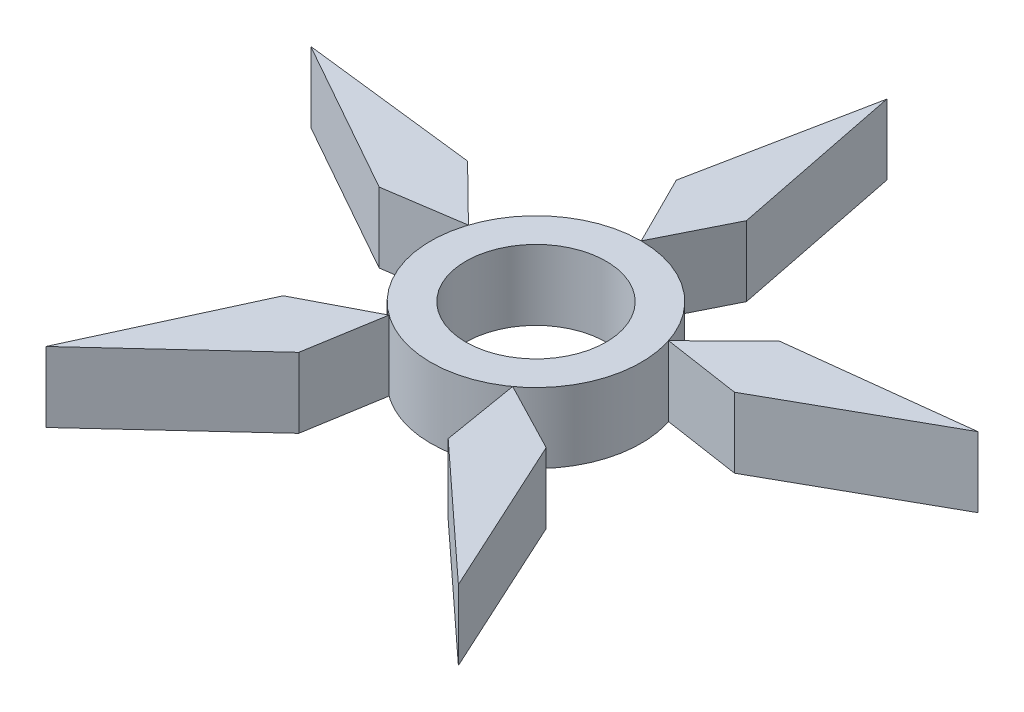
ISO-10303-21;
HEADER;
FILE_DESCRIPTION(('STEP AP214'),'2;1');
FILE_NAME('part.step','',(''),(''),'','','');
FILE_SCHEMA(('AUTOMOTIVE_DESIGN { 1 0 10303 214 1 1 1 1 }'));
ENDSEC;
DATA;
#1=APPLICATION_CONTEXT('core data for automotive mechanical design processes');
#2=APPLICATION_PROTOCOL_DEFINITION('international standard','automotive_design',2000,#1);
#3=PRODUCT_CONTEXT('',#1,'mechanical');
#4=PRODUCT('Part','Part','',(#3));
#5=PRODUCT_RELATED_PRODUCT_CATEGORY('part','',(#4));
#6=PRODUCT_DEFINITION_FORMATION('','',#4);
#7=PRODUCT_DEFINITION_CONTEXT('part definition',#1,'design');
#8=PRODUCT_DEFINITION('design','',#6,#7);
#9=PRODUCT_DEFINITION_SHAPE('','',#8);
#10=(LENGTH_UNIT() NAMED_UNIT(*) SI_UNIT(.MILLI.,.METRE.));
#11=(NAMED_UNIT(*) PLANE_ANGLE_UNIT() SI_UNIT($,.RADIAN.));
#12=(NAMED_UNIT(*) SI_UNIT($,.STERADIAN.) SOLID_ANGLE_UNIT());
#13=UNCERTAINTY_MEASURE_WITH_UNIT(LENGTH_MEASURE(1.E-05),#10,'distance_accuracy_value','');
#14=(GEOMETRIC_REPRESENTATION_CONTEXT(3) GLOBAL_UNCERTAINTY_ASSIGNED_CONTEXT((#13)) GLOBAL_UNIT_ASSIGNED_CONTEXT((#10,
#11,#12)) REPRESENTATION_CONTEXT('',''));
#15=CARTESIAN_POINT('',(0.,0.,0.));
#16=DIRECTION('',(0.,0.,1.));
#17=DIRECTION('',(1.,0.,0.));
#18=AXIS2_PLACEMENT_3D('',#15,#16,#17);
#19=CARTESIAN_POINT('',(-2.2231327935504,1.,-1.24807074408497));
#20=DIRECTION('',(-0.701718606426049,0.,0.712454207227022));
#21=DIRECTION('',(0.712454207227022,0.,0.701718606426049));
#22=AXIS2_PLACEMENT_3D('',#19,#20,#21);
#23=PLANE('',#22);
#24=DIRECTION('',(-0.712454207227022,0.,-0.701718606426049));
#25=VECTOR('',#24,1.);
#26=CARTESIAN_POINT('',(-2.2231327935504,0.,-1.24807074408497));
#27=LINE('',#26,#25);
#28=CARTESIAN_POINT('',(-1.42658477444273,0.,-0.463525491562437));
#29=VERTEX_POINT('',#28);
#30=CARTESIAN_POINT('',(-2.2231327935504,0.,-1.24807074408497));
#31=VERTEX_POINT('',#30);
#32=EDGE_CURVE('E107',#29,#31,#27,.T.);
#33=ORIENTED_EDGE('',*,*,#32,.T.);
#34=DIRECTION('',(0.,-1.,0.));
#35=VECTOR('',#34,1.);
#36=CARTESIAN_POINT('',(-2.2231327935504,1.,-1.24807074408497));
#37=LINE('',#36,#35);
#38=CARTESIAN_POINT('',(-2.2231327935504,1.,-1.24807074408497));
#39=VERTEX_POINT('',#38);
#40=EDGE_CURVE('E12',#39,#31,#37,.T.);
#41=ORIENTED_EDGE('',*,*,#40,.F.);
#42=DIRECTION('',(-0.712454207227022,0.,-0.701718606426049));
#43=VECTOR('',#42,1.);
#44=CARTESIAN_POINT('',(-2.2231327935504,1.,-1.24807074408497));
#45=LINE('',#44,#43);
#46=CARTESIAN_POINT('',(-1.42658477444273,1.,-0.463525491562437));
#47=VERTEX_POINT('',#46);
#48=EDGE_CURVE('E95',#47,#39,#45,.T.);
#49=ORIENTED_EDGE('',*,*,#48,.F.);
#50=DIRECTION('',(0.,-1.,0.));
#51=VECTOR('',#50,1.);
#52=CARTESIAN_POINT('',(-1.42658477444273,1.,-0.463525491562437));
#53=LINE('',#52,#51);
#54=EDGE_CURVE('E103',#47,#29,#53,.T.);
#55=ORIENTED_EDGE('',*,*,#54,.T.);
#56=EDGE_LOOP('',(#33,#41,#49,#55));
#57=FACE_BOUND('',#56,.T.);
#58=ADVANCED_FACE('F44',(#57),#23,.F.);
#59=CARTESIAN_POINT('',(-4.75528258147575,1.,-1.54508497187479));
#60=DIRECTION('',(-0.116498564870384,0.,0.993190859997786));
#61=DIRECTION('',(0.993190859997786,0.,0.116498564870384));
#62=AXIS2_PLACEMENT_3D('',#59,#60,#61);
#63=PLANE('',#62);
#64=DIRECTION('',(-0.993190859997786,0.,-0.116498564870384));
#65=VECTOR('',#64,1.);
#66=CARTESIAN_POINT('',(-4.75528258147575,0.,-1.54508497187479));
#67=LINE('',#66,#65);
#68=CARTESIAN_POINT('',(-4.75528258147575,0.,-1.54508497187479));
#69=VERTEX_POINT('',#68);
#70=EDGE_CURVE('E99',#31,#69,#67,.T.);
#71=ORIENTED_EDGE('',*,*,#70,.T.);
#72=DIRECTION('',(0.,-1.,0.));
#73=VECTOR('',#72,1.);
#74=CARTESIAN_POINT('',(-4.75528258147575,1.,-1.54508497187479));
#75=LINE('',#74,#73);
#76=CARTESIAN_POINT('',(-4.75528258147575,1.,-1.54508497187479));
#77=VERTEX_POINT('',#76);
#78=EDGE_CURVE('E52',#77,#69,#75,.T.);
#79=ORIENTED_EDGE('',*,*,#78,.F.);
#80=DIRECTION('',(-0.993190859997786,0.,-0.116498564870384));
#81=VECTOR('',#80,1.);
#82=CARTESIAN_POINT('',(-4.75528258147575,1.,-1.54508497187479));
#83=LINE('',#82,#81);
#84=EDGE_CURVE('E90',#39,#77,#83,.T.);
#85=ORIENTED_EDGE('',*,*,#84,.F.);
#86=ORIENTED_EDGE('',*,*,#40,.T.);
#87=EDGE_LOOP('',(#71,#79,#85,#86));
#88=FACE_BOUND('',#87,.T.);
#89=ADVANCED_FACE('F98',(#88),#63,.F.);
#90=CARTESIAN_POINT('',(-2.53214978792536,1.,-0.297014227789821));
#91=DIRECTION('',(0.489533621417964,0.,-0.871984422740116));
#92=DIRECTION('',(-0.871984422740116,0.,-0.489533621417964));
#93=AXIS2_PLACEMENT_3D('',#90,#91,#92);
#94=PLANE('',#93);
#95=DIRECTION('',(0.871984422740116,0.,0.489533621417964));
#96=VECTOR('',#95,1.);
#97=CARTESIAN_POINT('',(-2.53214978792536,0.,-0.297014227789821));
#98=LINE('',#97,#96);
#99=CARTESIAN_POINT('',(-2.53214978792536,0.,-0.297014227789821));
#100=VERTEX_POINT('',#99);
#101=EDGE_CURVE('E77',#69,#100,#98,.T.);
#102=ORIENTED_EDGE('',*,*,#101,.T.);
#103=DIRECTION('',(0.,-1.,0.));
#104=VECTOR('',#103,1.);
#105=CARTESIAN_POINT('',(-2.53214978792536,1.,-0.297014227789821));
#106=LINE('',#105,#104);
#107=CARTESIAN_POINT('',(-2.53214978792536,1.,-0.297014227789821));
#108=VERTEX_POINT('',#107);
#109=EDGE_CURVE('E100',#108,#100,#106,.T.);
#110=ORIENTED_EDGE('',*,*,#109,.F.);
#111=DIRECTION('',(0.871984422740116,0.,0.489533621417964));
#112=VECTOR('',#111,1.);
#113=CARTESIAN_POINT('',(-2.53214978792536,1.,-0.297014227789821));
#114=LINE('',#113,#112);
#115=EDGE_CURVE('E93',#77,#108,#114,.T.);
#116=ORIENTED_EDGE('',*,*,#115,.F.);
#117=ORIENTED_EDGE('',*,*,#78,.T.);
#118=EDGE_LOOP('',(#102,#110,#116,#117));
#119=FACE_BOUND('',#118,.T.);
#120=ADVANCED_FACE('F101',(#119),#94,.F.);
#121=CARTESIAN_POINT('',(-1.42658477444273,1.,-0.463525491562437));
#122=DIRECTION('',(-0.148932201925988,0.,-0.988847409477052));
#123=DIRECTION('',(-0.988847409477052,0.,0.148932201925988));
#124=AXIS2_PLACEMENT_3D('',#121,#122,#123);
#125=PLANE('',#124);
#126=DIRECTION('',(0.988847409477052,0.,-0.148932201925988));
#127=VECTOR('',#126,1.);
#128=CARTESIAN_POINT('',(-1.42658477444273,0.,-0.463525491562437));
#129=LINE('',#128,#127);
#130=EDGE_CURVE('E83',#100,#29,#129,.T.);
#131=ORIENTED_EDGE('',*,*,#130,.T.);
#132=ORIENTED_EDGE('',*,*,#54,.F.);
#133=DIRECTION('',(0.988847409477052,0.,-0.148932201925988));
#134=VECTOR('',#133,1.);
#135=CARTESIAN_POINT('',(-1.42658477444273,1.,-0.463525491562437));
#136=LINE('',#135,#134);
#137=EDGE_CURVE('E60',#108,#47,#136,.T.);
#138=ORIENTED_EDGE('',*,*,#137,.F.);
#139=ORIENTED_EDGE('',*,*,#109,.T.);
#140=EDGE_LOOP('',(#131,#132,#138,#139));
#141=FACE_BOUND('',#140,.T.);
#142=ADVANCED_FACE('F114',(#141),#125,.F.);
#143=CARTESIAN_POINT('',(0.,1.,0.));
#144=DIRECTION('',(0.,-1.,0.));
#145=DIRECTION('',(-0.95105651629515,0.,-0.309016994374958));
#146=AXIS2_PLACEMENT_3D('',#143,#144,#145);
#147=PLANE('',#146);
#148=ORIENTED_EDGE('',*,*,#48,.T.);
#149=ORIENTED_EDGE('',*,*,#84,.T.);
#150=ORIENTED_EDGE('',*,*,#115,.T.);
#151=ORIENTED_EDGE('',*,*,#137,.T.);
#152=EDGE_LOOP('',(#148,#149,#150,#151));
#153=FACE_BOUND('',#152,.T.);
#154=ADVANCED_FACE('F91',(#153),#147,.F.);
#155=CARTESIAN_POINT('',(0.,0.,0.));
#156=DIRECTION('',(0.,-1.,0.));
#157=DIRECTION('',(-0.95105651629515,0.,-0.309016994374958));
#158=AXIS2_PLACEMENT_3D('',#155,#156,#157);
#159=PLANE('',#158);
#160=ORIENTED_EDGE('',*,*,#32,.F.);
#161=ORIENTED_EDGE('',*,*,#130,.F.);
#162=ORIENTED_EDGE('',*,*,#101,.F.);
#163=ORIENTED_EDGE('',*,*,#70,.F.);
#164=EDGE_LOOP('',(#160,#161,#162,#163));
#165=FACE_BOUND('',#164,.T.);
#166=ADVANCED_FACE('F117',(#165),#159,.T.);
#167=CLOSED_SHELL('',(#58,#89,#120,#142,#154,#166));
#168=MANIFOLD_SOLID_BREP('B2',#167);
#169=CARTESIAN_POINT('',(-1.87397162791867,1.,1.72864985979112));
#170=DIRECTION('',(0.460741241690404,0.,0.887534510994127));
#171=DIRECTION('',(0.887534510994127,0.,-0.460741241690404));
#172=AXIS2_PLACEMENT_3D('',#169,#170,#171);
#173=PLANE('',#172);
#174=DIRECTION('',(-0.887534510994127,0.,0.460741241690404));
#175=VECTOR('',#174,1.);
#176=CARTESIAN_POINT('',(-1.87397162791867,0.,1.72864985979112));
#177=LINE('',#176,#175);
#178=CARTESIAN_POINT('',(-0.88167787843872,0.,1.21352549156241));
#179=VERTEX_POINT('',#178);
#180=CARTESIAN_POINT('',(-1.87397162791867,0.,1.72864985979112));
#181=VERTEX_POINT('',#180);
#182=EDGE_CURVE('E241',#179,#181,#177,.T.);
#183=ORIENTED_EDGE('',*,*,#182,.T.);
#184=DIRECTION('',(0.,-1.,0.));
#185=VECTOR('',#184,1.);
#186=CARTESIAN_POINT('',(-1.87397162791867,1.,1.72864985979112));
#187=LINE('',#186,#185);
#188=CARTESIAN_POINT('',(-1.87397162791867,1.,1.72864985979112));
#189=VERTEX_POINT('',#188);
#190=EDGE_CURVE('E42',#189,#181,#187,.T.);
#191=ORIENTED_EDGE('',*,*,#190,.F.);
#192=DIRECTION('',(-0.887534510994127,0.,0.460741241690404));
#193=VECTOR('',#192,1.);
#194=CARTESIAN_POINT('',(-1.87397162791867,1.,1.72864985979112));
#195=LINE('',#194,#193);
#196=CARTESIAN_POINT('',(-0.88167787843872,1.,1.21352549156241));
#197=VERTEX_POINT('',#196);
#198=EDGE_CURVE('E229',#197,#189,#195,.T.);
#199=ORIENTED_EDGE('',*,*,#198,.F.);
#200=DIRECTION('',(0.,-1.,0.));
#201=VECTOR('',#200,1.);
#202=CARTESIAN_POINT('',(-0.88167787843872,1.,1.21352549156241));
#203=LINE('',#202,#201);
#204=EDGE_CURVE('E237',#197,#179,#203,.T.);
#205=ORIENTED_EDGE('',*,*,#204,.T.);
#206=EDGE_LOOP('',(#183,#191,#199,#205));
#207=FACE_BOUND('',#206,.T.);
#208=ADVANCED_FACE('F178',(#207),#173,.F.);
#209=CARTESIAN_POINT('',(-2.9389262614624,1.,4.04508497187471));
#210=DIRECTION('',(0.908580602960442,0.,0.417709573656195));
#211=DIRECTION('',(0.417709573656195,0.,-0.908580602960442));
#212=AXIS2_PLACEMENT_3D('',#209,#210,#211);
#213=PLANE('',#212);
#214=DIRECTION('',(-0.417709573656195,0.,0.908580602960442));
#215=VECTOR('',#214,1.);
#216=CARTESIAN_POINT('',(-2.9389262614624,0.,4.04508497187471));
#217=LINE('',#216,#215);
#218=CARTESIAN_POINT('',(-2.9389262614624,0.,4.04508497187471));
#219=VERTEX_POINT('',#218);
#220=EDGE_CURVE('E233',#181,#219,#217,.T.);
#221=ORIENTED_EDGE('',*,*,#220,.T.);
#222=DIRECTION('',(0.,-1.,0.));
#223=VECTOR('',#222,1.);
#224=CARTESIAN_POINT('',(-2.9389262614624,1.,4.04508497187471));
#225=LINE('',#224,#223);
#226=CARTESIAN_POINT('',(-2.9389262614624,1.,4.04508497187471));
#227=VERTEX_POINT('',#226);
#228=EDGE_CURVE('E186',#227,#219,#225,.T.);
#229=ORIENTED_EDGE('',*,*,#228,.F.);
#230=DIRECTION('',(-0.417709573656195,0.,0.908580602960442));
#231=VECTOR('',#230,1.);
#232=CARTESIAN_POINT('',(-2.9389262614624,1.,4.04508497187471));
#233=LINE('',#232,#231);
#234=EDGE_CURVE('E224',#189,#227,#233,.T.);
#235=ORIENTED_EDGE('',*,*,#234,.F.);
#236=ORIENTED_EDGE('',*,*,#190,.T.);
#237=EDGE_LOOP('',(#221,#229,#235,#236));
#238=FACE_BOUND('',#237,.T.);
#239=ADVANCED_FACE('F232',(#238),#213,.F.);
#240=CARTESIAN_POINT('',(-1.06495463354373,1.,2.3164351120836));
#241=DIRECTION('',(-0.678032259018794,0.,-0.735032146052042));
#242=DIRECTION('',(-0.735032146052042,0.,0.678032259018795));
#243=AXIS2_PLACEMENT_3D('',#240,#241,#242);
#244=PLANE('',#243);
#245=DIRECTION('',(0.735032146052042,0.,-0.678032259018794));
#246=VECTOR('',#245,1.);
#247=CARTESIAN_POINT('',(-1.06495463354373,0.,2.3164351120836));
#248=LINE('',#247,#246);
#249=CARTESIAN_POINT('',(-1.06495463354373,0.,2.3164351120836));
#250=VERTEX_POINT('',#249);
#251=EDGE_CURVE('E211',#219,#250,#248,.T.);
#252=ORIENTED_EDGE('',*,*,#251,.T.);
#253=DIRECTION('',(0.,-1.,0.));
#254=VECTOR('',#253,1.);
#255=CARTESIAN_POINT('',(-1.06495463354373,1.,2.3164351120836));
#256=LINE('',#255,#254);
#257=CARTESIAN_POINT('',(-1.06495463354373,1.,2.3164351120836));
#258=VERTEX_POINT('',#257);
#259=EDGE_CURVE('E234',#258,#250,#256,.T.);
#260=ORIENTED_EDGE('',*,*,#259,.F.);
#261=DIRECTION('',(0.735032146052042,0.,-0.678032259018794));
#262=VECTOR('',#261,1.);
#263=CARTESIAN_POINT('',(-1.06495463354373,1.,2.3164351120836));
#264=LINE('',#263,#262);
#265=EDGE_CURVE('E227',#227,#258,#264,.T.);
#266=ORIENTED_EDGE('',*,*,#265,.F.);
#267=ORIENTED_EDGE('',*,*,#228,.T.);
#268=EDGE_LOOP('',(#252,#260,#266,#267));
#269=FACE_BOUND('',#268,.T.);
#270=ADVANCED_FACE('F235',(#269),#244,.F.);
#271=CARTESIAN_POINT('',(-0.88167787843872,1.,1.21352549156241));
#272=DIRECTION('',(-0.986472353809544,0.,-0.163927713244153));
#273=DIRECTION('',(-0.163927713244153,0.,0.986472353809545));
#274=AXIS2_PLACEMENT_3D('',#271,#272,#273);
#275=PLANE('',#274);
#276=DIRECTION('',(0.163927713244153,0.,-0.986472353809544));
#277=VECTOR('',#276,1.);
#278=CARTESIAN_POINT('',(-0.88167787843872,0.,1.21352549156241));
#279=LINE('',#278,#277);
#280=EDGE_CURVE('E217',#250,#179,#279,.T.);
#281=ORIENTED_EDGE('',*,*,#280,.T.);
#282=ORIENTED_EDGE('',*,*,#204,.F.);
#283=DIRECTION('',(0.163927713244153,0.,-0.986472353809544));
#284=VECTOR('',#283,1.);
#285=CARTESIAN_POINT('',(-0.88167787843872,1.,1.21352549156241));
#286=LINE('',#285,#284);
#287=EDGE_CURVE('E194',#258,#197,#286,.T.);
#288=ORIENTED_EDGE('',*,*,#287,.F.);
#289=ORIENTED_EDGE('',*,*,#259,.T.);
#290=EDGE_LOOP('',(#281,#282,#288,#289));
#291=FACE_BOUND('',#290,.T.);
#292=ADVANCED_FACE('F248',(#291),#275,.F.);
#293=CARTESIAN_POINT('',(0.,1.,0.));
#294=DIRECTION('',(0.,-1.,0.));
#295=DIRECTION('',(-0.58778525229248,0.,0.809016994374942));
#296=AXIS2_PLACEMENT_3D('',#293,#294,#295);
#297=PLANE('',#296);
#298=ORIENTED_EDGE('',*,*,#198,.T.);
#299=ORIENTED_EDGE('',*,*,#234,.T.);
#300=ORIENTED_EDGE('',*,*,#265,.T.);
#301=ORIENTED_EDGE('',*,*,#287,.T.);
#302=EDGE_LOOP('',(#298,#299,#300,#301));
#303=FACE_BOUND('',#302,.T.);
#304=ADVANCED_FACE('F225',(#303),#297,.F.);
#305=CARTESIAN_POINT('',(0.,0.,0.));
#306=DIRECTION('',(0.,-1.,0.));
#307=DIRECTION('',(-0.58778525229248,0.,0.809016994374942));
#308=AXIS2_PLACEMENT_3D('',#305,#306,#307);
#309=PLANE('',#308);
#310=ORIENTED_EDGE('',*,*,#182,.F.);
#311=ORIENTED_EDGE('',*,*,#280,.F.);
#312=ORIENTED_EDGE('',*,*,#251,.F.);
#313=ORIENTED_EDGE('',*,*,#220,.F.);
#314=EDGE_LOOP('',(#310,#311,#312,#313));
#315=FACE_BOUND('',#314,.T.);
#316=ADVANCED_FACE('F251',(#315),#309,.T.);
#317=CLOSED_SHELL('',(#208,#239,#270,#292,#304,#316));
#318=MANIFOLD_SOLID_BREP('B6',#317);
#319=CARTESIAN_POINT('',(1.0649546335437,1.,2.31643511208361));
#320=DIRECTION('',(0.986472353809547,0.,-0.163927713244139));
#321=DIRECTION('',(-0.163927713244139,0.,-0.986472353809547));
#322=AXIS2_PLACEMENT_3D('',#319,#320,#321);
#323=PLANE('',#322);
#324=DIRECTION('',(0.163927713244139,0.,0.986472353809547));
#325=VECTOR('',#324,1.);
#326=CARTESIAN_POINT('',(1.0649546335437,0.,2.31643511208361));
#327=LINE('',#326,#325);
#328=CARTESIAN_POINT('',(0.881677878438703,0.,1.21352549156243));
#329=VERTEX_POINT('',#328);
#330=CARTESIAN_POINT('',(1.0649546335437,0.,2.31643511208361));
#331=VERTEX_POINT('',#330);
#332=EDGE_CURVE('E375',#329,#331,#327,.T.);
#333=ORIENTED_EDGE('',*,*,#332,.T.);
#334=DIRECTION('',(0.,-1.,0.));
#335=VECTOR('',#334,1.);
#336=CARTESIAN_POINT('',(1.0649546335437,1.,2.31643511208361));
#337=LINE('',#336,#335);
#338=CARTESIAN_POINT('',(1.0649546335437,1.,2.31643511208361));
#339=VERTEX_POINT('',#338);
#340=EDGE_CURVE('E176',#339,#331,#337,.T.);
#341=ORIENTED_EDGE('',*,*,#340,.F.);
#342=DIRECTION('',(0.163927713244139,0.,0.986472353809547));
#343=VECTOR('',#342,1.);
#344=CARTESIAN_POINT('',(1.0649546335437,1.,2.31643511208361));
#345=LINE('',#344,#343);
#346=CARTESIAN_POINT('',(0.881677878438703,1.,1.21352549156243));
#347=VERTEX_POINT('',#346);
#348=EDGE_CURVE('E363',#347,#339,#345,.T.);
#349=ORIENTED_EDGE('',*,*,#348,.F.);
#350=DIRECTION('',(0.,-1.,0.));
#351=VECTOR('',#350,1.);
#352=CARTESIAN_POINT('',(0.881677878438703,1.,1.21352549156243));
#353=LINE('',#352,#351);
#354=EDGE_CURVE('E371',#347,#329,#353,.T.);
#355=ORIENTED_EDGE('',*,*,#354,.T.);
#356=EDGE_LOOP('',(#333,#341,#349,#355));
#357=FACE_BOUND('',#356,.T.);
#358=ADVANCED_FACE('F312',(#357),#323,.F.);
#359=CARTESIAN_POINT('',(2.93892626146234,1.,4.04508497187475));
#360=DIRECTION('',(0.678032259018805,0.,-0.735032146052032));
#361=DIRECTION('',(-0.735032146052032,0.,-0.678032259018805));
#362=AXIS2_PLACEMENT_3D('',#359,#360,#361);
#363=PLANE('',#362);
#364=DIRECTION('',(0.735032146052032,0.,0.678032259018805));
#365=VECTOR('',#364,1.);
#366=CARTESIAN_POINT('',(2.93892626146234,0.,4.04508497187475));
#367=LINE('',#366,#365);
#368=CARTESIAN_POINT('',(2.93892626146234,0.,4.04508497187475));
#369=VERTEX_POINT('',#368);
#370=EDGE_CURVE('E367',#331,#369,#367,.T.);
#371=ORIENTED_EDGE('',*,*,#370,.T.);
#372=DIRECTION('',(0.,-1.,0.));
#373=VECTOR('',#372,1.);
#374=CARTESIAN_POINT('',(2.93892626146234,1.,4.04508497187475));
#375=LINE('',#374,#373);
#376=CARTESIAN_POINT('',(2.93892626146234,1.,4.04508497187475));
#377=VERTEX_POINT('',#376);
#378=EDGE_CURVE('E320',#377,#369,#375,.T.);
#379=ORIENTED_EDGE('',*,*,#378,.F.);
#380=DIRECTION('',(0.735032146052032,0.,0.678032259018805));
#381=VECTOR('',#380,1.);
#382=CARTESIAN_POINT('',(2.93892626146234,1.,4.04508497187475));
#383=LINE('',#382,#381);
#384=EDGE_CURVE('E358',#339,#377,#383,.T.);
#385=ORIENTED_EDGE('',*,*,#384,.F.);
#386=ORIENTED_EDGE('',*,*,#340,.T.);
#387=EDGE_LOOP('',(#371,#379,#385,#386));
#388=FACE_BOUND('',#387,.T.);
#389=ADVANCED_FACE('F366',(#388),#363,.F.);
#390=CARTESIAN_POINT('',(1.87397162791865,1.,1.72864985979114));
#391=DIRECTION('',(-0.908580602960448,0.,0.417709573656181));
#392=DIRECTION('',(0.417709573656182,0.,0.908580602960448));
#393=AXIS2_PLACEMENT_3D('',#390,#391,#392);
#394=PLANE('',#393);
#395=DIRECTION('',(-0.417709573656181,0.,-0.908580602960448));
#396=VECTOR('',#395,1.);
#397=CARTESIAN_POINT('',(1.87397162791865,0.,1.72864985979114));
#398=LINE('',#397,#396);
#399=CARTESIAN_POINT('',(1.87397162791865,0.,1.72864985979114));
#400=VERTEX_POINT('',#399);
#401=EDGE_CURVE('E345',#369,#400,#398,.T.);
#402=ORIENTED_EDGE('',*,*,#401,.T.);
#403=DIRECTION('',(0.,-1.,0.));
#404=VECTOR('',#403,1.);
#405=CARTESIAN_POINT('',(1.87397162791865,1.,1.72864985979114));
#406=LINE('',#405,#404);
#407=CARTESIAN_POINT('',(1.87397162791865,1.,1.72864985979114));
#408=VERTEX_POINT('',#407);
#409=EDGE_CURVE('E368',#408,#400,#406,.T.);
#410=ORIENTED_EDGE('',*,*,#409,.F.);
#411=DIRECTION('',(-0.417709573656181,0.,-0.908580602960448));
#412=VECTOR('',#411,1.);
#413=CARTESIAN_POINT('',(1.87397162791865,1.,1.72864985979114));
#414=LINE('',#413,#412);
#415=EDGE_CURVE('E361',#377,#408,#414,.T.);
#416=ORIENTED_EDGE('',*,*,#415,.F.);
#417=ORIENTED_EDGE('',*,*,#378,.T.);
#418=EDGE_LOOP('',(#402,#410,#416,#417));
#419=FACE_BOUND('',#418,.T.);
#420=ADVANCED_FACE('F369',(#419),#394,.F.);
#421=CARTESIAN_POINT('',(0.881677878438703,1.,1.21352549156243));
#422=DIRECTION('',(-0.460741241690417,0.,0.88753451099412));
#423=DIRECTION('',(0.887534510994121,0.,0.460741241690417));
#424=AXIS2_PLACEMENT_3D('',#421,#422,#423);
#425=PLANE('',#424);
#426=DIRECTION('',(-0.88753451099412,0.,-0.460741241690417));
#427=VECTOR('',#426,1.);
#428=CARTESIAN_POINT('',(0.881677878438703,0.,1.21352549156243));
#429=LINE('',#428,#427);
#430=EDGE_CURVE('E351',#400,#329,#429,.T.);
#431=ORIENTED_EDGE('',*,*,#430,.T.);
#432=ORIENTED_EDGE('',*,*,#354,.F.);
#433=DIRECTION('',(-0.88753451099412,0.,-0.460741241690417));
#434=VECTOR('',#433,1.);
#435=CARTESIAN_POINT('',(0.881677878438703,1.,1.21352549156243));
#436=LINE('',#435,#434);
#437=EDGE_CURVE('E328',#408,#347,#436,.T.);
#438=ORIENTED_EDGE('',*,*,#437,.F.);
#439=ORIENTED_EDGE('',*,*,#409,.T.);
#440=EDGE_LOOP('',(#431,#432,#438,#439));
#441=FACE_BOUND('',#440,.T.);
#442=ADVANCED_FACE('F382',(#441),#425,.F.);
#443=CARTESIAN_POINT('',(0.,1.,0.));
#444=DIRECTION('',(0.,-1.,0.));
#445=DIRECTION('',(0.587785252292469,0.,0.809016994374951));
#446=AXIS2_PLACEMENT_3D('',#443,#444,#445);
#447=PLANE('',#446);
#448=ORIENTED_EDGE('',*,*,#348,.T.);
#449=ORIENTED_EDGE('',*,*,#384,.T.);
#450=ORIENTED_EDGE('',*,*,#415,.T.);
#451=ORIENTED_EDGE('',*,*,#437,.T.);
#452=EDGE_LOOP('',(#448,#449,#450,#451));
#453=FACE_BOUND('',#452,.T.);
#454=ADVANCED_FACE('F359',(#453),#447,.F.);
#455=CARTESIAN_POINT('',(0.,0.,0.));
#456=DIRECTION('',(0.,-1.,0.));
#457=DIRECTION('',(0.587785252292469,0.,0.809016994374951));
#458=AXIS2_PLACEMENT_3D('',#455,#456,#457);
#459=PLANE('',#458);
#460=ORIENTED_EDGE('',*,*,#332,.F.);
#461=ORIENTED_EDGE('',*,*,#430,.F.);
#462=ORIENTED_EDGE('',*,*,#401,.F.);
#463=ORIENTED_EDGE('',*,*,#370,.F.);
#464=EDGE_LOOP('',(#460,#461,#462,#463));
#465=FACE_BOUND('',#464,.T.);
#466=ADVANCED_FACE('F385',(#465),#459,.T.);
#467=CLOSED_SHELL('',(#358,#389,#420,#442,#454,#466));
#468=MANIFOLD_SOLID_BREP('B36',#467);
#469=CARTESIAN_POINT('',(2.53214978792536,1.,-0.297014227789785));
#470=DIRECTION('',(0.148932201926002,0.,-0.98884740947705));
#471=DIRECTION('',(-0.98884740947705,0.,-0.148932201926002));
#472=AXIS2_PLACEMENT_3D('',#469,#470,#471);
#473=PLANE('',#472);
#474=DIRECTION('',(0.98884740947705,0.,0.148932201926002));
#475=VECTOR('',#474,1.);
#476=CARTESIAN_POINT('',(2.53214978792536,0.,-0.297014227789785));
#477=LINE('',#476,#475);
#478=CARTESIAN_POINT('',(1.42658477444273,0.,-0.463525491562417));
#479=VERTEX_POINT('',#478);
#480=CARTESIAN_POINT('',(2.53214978792536,0.,-0.297014227789785));
#481=VERTEX_POINT('',#480);
#482=EDGE_CURVE('E509',#479,#481,#477,.T.);
#483=ORIENTED_EDGE('',*,*,#482,.T.);
#484=DIRECTION('',(0.,-1.,0.));
#485=VECTOR('',#484,1.);
#486=CARTESIAN_POINT('',(2.53214978792536,1.,-0.297014227789785));
#487=LINE('',#486,#485);
#488=CARTESIAN_POINT('',(2.53214978792536,1.,-0.297014227789785));
#489=VERTEX_POINT('',#488);
#490=EDGE_CURVE('E310',#489,#481,#487,.T.);
#491=ORIENTED_EDGE('',*,*,#490,.F.);
#492=DIRECTION('',(0.98884740947705,0.,0.148932201926002));
#493=VECTOR('',#492,1.);
#494=CARTESIAN_POINT('',(2.53214978792536,1.,-0.297014227789785));
#495=LINE('',#494,#493);
#496=CARTESIAN_POINT('',(1.42658477444273,1.,-0.463525491562417));
#497=VERTEX_POINT('',#496);
#498=EDGE_CURVE('E497',#497,#489,#495,.T.);
#499=ORIENTED_EDGE('',*,*,#498,.F.);
#500=DIRECTION('',(0.,-1.,0.));
#501=VECTOR('',#500,1.);
#502=CARTESIAN_POINT('',(1.42658477444273,1.,-0.463525491562417));
#503=LINE('',#502,#501);
#504=EDGE_CURVE('E505',#497,#479,#503,.T.);
#505=ORIENTED_EDGE('',*,*,#504,.T.);
#506=EDGE_LOOP('',(#483,#491,#499,#505));
#507=FACE_BOUND('',#506,.T.);
#508=ADVANCED_FACE('F446',(#507),#473,.F.);
#509=CARTESIAN_POINT('',(4.75528258147577,1.,-1.54508497187472));
#510=DIRECTION('',(-0.489533621417952,0.,-0.871984422740123));
#511=DIRECTION('',(-0.871984422740123,0.,0.489533621417952));
#512=AXIS2_PLACEMENT_3D('',#509,#510,#511);
#513=PLANE('',#512);
#514=DIRECTION('',(0.871984422740123,0.,-0.489533621417952));
#515=VECTOR('',#514,1.);
#516=CARTESIAN_POINT('',(4.75528258147577,0.,-1.54508497187472));
#517=LINE('',#516,#515);
#518=CARTESIAN_POINT('',(4.75528258147577,0.,-1.54508497187472));
#519=VERTEX_POINT('',#518);
#520=EDGE_CURVE('E501',#481,#519,#517,.T.);
#521=ORIENTED_EDGE('',*,*,#520,.T.);
#522=DIRECTION('',(0.,-1.,0.));
#523=VECTOR('',#522,1.);
#524=CARTESIAN_POINT('',(4.75528258147577,1.,-1.54508497187472));
#525=LINE('',#524,#523);
#526=CARTESIAN_POINT('',(4.75528258147577,1.,-1.54508497187472));
#527=VERTEX_POINT('',#526);
#528=EDGE_CURVE('E454',#527,#519,#525,.T.);
#529=ORIENTED_EDGE('',*,*,#528,.F.);
#530=DIRECTION('',(0.871984422740123,0.,-0.489533621417952));
#531=VECTOR('',#530,1.);
#532=CARTESIAN_POINT('',(4.75528258147577,1.,-1.54508497187472));
#533=LINE('',#532,#531);
#534=EDGE_CURVE('E492',#489,#527,#533,.T.);
#535=ORIENTED_EDGE('',*,*,#534,.F.);
#536=ORIENTED_EDGE('',*,*,#490,.T.);
#537=EDGE_LOOP('',(#521,#529,#535,#536));
#538=FACE_BOUND('',#537,.T.);
#539=ADVANCED_FACE('F500',(#538),#513,.F.);
#540=CARTESIAN_POINT('',(2.22313279355041,1.,-1.24807074408494));
#541=DIRECTION('',(0.11649856487037,0.,0.993190859997787));
#542=DIRECTION('',(0.993190859997788,0.,-0.11649856487037));
#543=AXIS2_PLACEMENT_3D('',#540,#541,#542);
#544=PLANE('',#543);
#545=DIRECTION('',(-0.993190859997787,0.,0.11649856487037));
#546=VECTOR('',#545,1.);
#547=CARTESIAN_POINT('',(2.22313279355041,0.,-1.24807074408494));
#548=LINE('',#547,#546);
#549=CARTESIAN_POINT('',(2.22313279355041,0.,-1.24807074408494));
#550=VERTEX_POINT('',#549);
#551=EDGE_CURVE('E479',#519,#550,#548,.T.);
#552=ORIENTED_EDGE('',*,*,#551,.T.);
#553=DIRECTION('',(0.,-1.,0.));
#554=VECTOR('',#553,1.);
#555=CARTESIAN_POINT('',(2.22313279355041,1.,-1.24807074408494));
#556=LINE('',#555,#554);
#557=CARTESIAN_POINT('',(2.22313279355041,1.,-1.24807074408494));
#558=VERTEX_POINT('',#557);
#559=EDGE_CURVE('E502',#558,#550,#556,.T.);
#560=ORIENTED_EDGE('',*,*,#559,.F.);
#561=DIRECTION('',(-0.993190859997787,0.,0.11649856487037));
#562=VECTOR('',#561,1.);
#563=CARTESIAN_POINT('',(2.22313279355041,1.,-1.24807074408494));
#564=LINE('',#563,#562);
#565=EDGE_CURVE('E495',#527,#558,#564,.T.);
#566=ORIENTED_EDGE('',*,*,#565,.F.);
#567=ORIENTED_EDGE('',*,*,#528,.T.);
#568=EDGE_LOOP('',(#552,#560,#566,#567));
#569=FACE_BOUND('',#568,.T.);
#570=ADVANCED_FACE('F503',(#569),#544,.F.);
#571=CARTESIAN_POINT('',(1.42658477444273,1.,-0.463525491562417));
#572=DIRECTION('',(0.701718606426039,0.,0.712454207227032));
#573=DIRECTION('',(0.712454207227032,0.,-0.701718606426039));
#574=AXIS2_PLACEMENT_3D('',#571,#572,#573);
#575=PLANE('',#574);
#576=DIRECTION('',(-0.712454207227032,0.,0.701718606426039));
#577=VECTOR('',#576,1.);
#578=CARTESIAN_POINT('',(1.42658477444273,0.,-0.463525491562417));
#579=LINE('',#578,#577);
#580=EDGE_CURVE('E485',#550,#479,#579,.T.);
#581=ORIENTED_EDGE('',*,*,#580,.T.);
#582=ORIENTED_EDGE('',*,*,#504,.F.);
#583=DIRECTION('',(-0.712454207227032,0.,0.701718606426039));
#584=VECTOR('',#583,1.);
#585=CARTESIAN_POINT('',(1.42658477444273,1.,-0.463525491562417));
#586=LINE('',#585,#584);
#587=EDGE_CURVE('E462',#558,#497,#586,.T.);
#588=ORIENTED_EDGE('',*,*,#587,.F.);
#589=ORIENTED_EDGE('',*,*,#559,.T.);
#590=EDGE_LOOP('',(#581,#582,#588,#589));
#591=FACE_BOUND('',#590,.T.);
#592=ADVANCED_FACE('F516',(#591),#575,.F.);
#593=CARTESIAN_POINT('',(0.,1.,0.));
#594=DIRECTION('',(0.,-1.,0.));
#595=DIRECTION('',(0.951056516295155,0.,-0.309016994374945));
#596=AXIS2_PLACEMENT_3D('',#593,#594,#595);
#597=PLANE('',#596);
#598=ORIENTED_EDGE('',*,*,#498,.T.);
#599=ORIENTED_EDGE('',*,*,#534,.T.);
#600=ORIENTED_EDGE('',*,*,#565,.T.);
#601=ORIENTED_EDGE('',*,*,#587,.T.);
#602=EDGE_LOOP('',(#598,#599,#600,#601));
#603=FACE_BOUND('',#602,.T.);
#604=ADVANCED_FACE('F493',(#603),#597,.F.);
#605=CARTESIAN_POINT('',(0.,0.,0.));
#606=DIRECTION('',(0.,-1.,0.));
#607=DIRECTION('',(0.951056516295155,0.,-0.309016994374945));
#608=AXIS2_PLACEMENT_3D('',#605,#606,#607);
#609=PLANE('',#608);
#610=ORIENTED_EDGE('',*,*,#482,.F.);
#611=ORIENTED_EDGE('',*,*,#580,.F.);
#612=ORIENTED_EDGE('',*,*,#551,.F.);
#613=ORIENTED_EDGE('',*,*,#520,.F.);
#614=EDGE_LOOP('',(#610,#611,#612,#613));
#615=FACE_BOUND('',#614,.T.);
#616=ADVANCED_FACE('F519',(#615),#609,.T.);
#617=CLOSED_SHELL('',(#508,#539,#570,#592,#604,#616));
#618=MANIFOLD_SOLID_BREP('B170',#617);
#619=CARTESIAN_POINT('',(0.5,1.,-2.5));
#620=DIRECTION('',(-0.894427190999916,0.,-0.447213595499958));
#621=DIRECTION('',(-0.447213595499958,0.,0.894427190999916));
#622=AXIS2_PLACEMENT_3D('',#619,#620,#621);
#623=PLANE('',#622);
#624=DIRECTION('',(0.447213595499958,0.,-0.894427190999916));
#625=VECTOR('',#624,1.);
#626=CARTESIAN_POINT('',(0.5,0.,-2.5));
#627=LINE('',#626,#625);
#628=CARTESIAN_POINT('',(0.,0.,-1.5));
#629=VERTEX_POINT('',#628);
#630=CARTESIAN_POINT('',(0.5,0.,-2.5));
#631=VERTEX_POINT('',#630);
#632=EDGE_CURVE('E640',#629,#631,#627,.T.);
#633=ORIENTED_EDGE('',*,*,#632,.T.);
#634=DIRECTION('',(0.,-1.,0.));
#635=VECTOR('',#634,1.);
#636=CARTESIAN_POINT('',(0.5,1.,-2.5));
#637=LINE('',#636,#635);
#638=CARTESIAN_POINT('',(0.5,1.,-2.5));
#639=VERTEX_POINT('',#638);
#640=EDGE_CURVE('E444',#639,#631,#637,.T.);
#641=ORIENTED_EDGE('',*,*,#640,.F.);
#642=DIRECTION('',(0.447213595499958,0.,-0.894427190999916));
#643=VECTOR('',#642,1.);
#644=CARTESIAN_POINT('',(0.5,1.,-2.5));
#645=LINE('',#644,#643);
#646=CARTESIAN_POINT('',(0.,1.,-1.5));
#647=VERTEX_POINT('',#646);
#648=EDGE_CURVE('E628',#647,#639,#645,.T.);
#649=ORIENTED_EDGE('',*,*,#648,.F.);
#650=DIRECTION('',(0.,-1.,0.));
#651=VECTOR('',#650,1.);
#652=CARTESIAN_POINT('',(0.,1.,-1.5));
#653=LINE('',#652,#651);
#654=EDGE_CURVE('E636',#647,#629,#653,.T.);
#655=ORIENTED_EDGE('',*,*,#654,.T.);
#656=EDGE_LOOP('',(#633,#641,#649,#655));
#657=FACE_BOUND('',#656,.T.);
#658=ADVANCED_FACE('F577',(#657),#623,.F.);
#659=CARTESIAN_POINT('',(0.,1.,-5.));
#660=DIRECTION('',(-0.98058067569092,0.,0.196116135138184));
#661=DIRECTION('',(0.196116135138184,0.,0.98058067569092));
#662=AXIS2_PLACEMENT_3D('',#659,#660,#661);
#663=PLANE('',#662);
#664=DIRECTION('',(-0.196116135138184,0.,-0.98058067569092));
#665=VECTOR('',#664,1.);
#666=CARTESIAN_POINT('',(0.,0.,-5.));
#667=LINE('',#666,#665);
#668=CARTESIAN_POINT('',(0.,0.,-5.));
#669=VERTEX_POINT('',#668);
#670=EDGE_CURVE('E632',#631,#669,#667,.T.);
#671=ORIENTED_EDGE('',*,*,#670,.T.);
#672=DIRECTION('',(0.,-1.,0.));
#673=VECTOR('',#672,1.);
#674=CARTESIAN_POINT('',(0.,1.,-5.));
#675=LINE('',#674,#673);
#676=CARTESIAN_POINT('',(0.,1.,-5.));
#677=VERTEX_POINT('',#676);
#678=EDGE_CURVE('E585',#677,#669,#675,.T.);
#679=ORIENTED_EDGE('',*,*,#678,.F.);
#680=DIRECTION('',(-0.196116135138184,0.,-0.98058067569092));
#681=VECTOR('',#680,1.);
#682=CARTESIAN_POINT('',(0.,1.,-5.));
#683=LINE('',#682,#681);
#684=EDGE_CURVE('E623',#639,#677,#683,.T.);
#685=ORIENTED_EDGE('',*,*,#684,.F.);
#686=ORIENTED_EDGE('',*,*,#640,.T.);
#687=EDGE_LOOP('',(#671,#679,#685,#686));
#688=FACE_BOUND('',#687,.T.);
#689=ADVANCED_FACE('F631',(#688),#663,.F.);
#690=CARTESIAN_POINT('',(-0.5,1.,-2.5));
#691=DIRECTION('',(0.98058067569092,0.,0.196116135138184));
#692=DIRECTION('',(0.196116135138184,0.,-0.98058067569092));
#693=AXIS2_PLACEMENT_3D('',#690,#691,#692);
#694=PLANE('',#693);
#695=DIRECTION('',(-0.196116135138184,0.,0.98058067569092));
#696=VECTOR('',#695,1.);
#697=CARTESIAN_POINT('',(-0.5,0.,-2.5));
#698=LINE('',#697,#696);
#699=CARTESIAN_POINT('',(-0.5,0.,-2.5));
#700=VERTEX_POINT('',#699);
#701=EDGE_CURVE('E610',#669,#700,#698,.T.);
#702=ORIENTED_EDGE('',*,*,#701,.T.);
#703=DIRECTION('',(0.,-1.,0.));
#704=VECTOR('',#703,1.);
#705=CARTESIAN_POINT('',(-0.5,1.,-2.5));
#706=LINE('',#705,#704);
#707=CARTESIAN_POINT('',(-0.5,1.,-2.5));
#708=VERTEX_POINT('',#707);
#709=EDGE_CURVE('E633',#708,#700,#706,.T.);
#710=ORIENTED_EDGE('',*,*,#709,.F.);
#711=DIRECTION('',(-0.196116135138184,0.,0.98058067569092));
#712=VECTOR('',#711,1.);
#713=CARTESIAN_POINT('',(-0.5,1.,-2.5));
#714=LINE('',#713,#712);
#715=EDGE_CURVE('E626',#677,#708,#714,.T.);
#716=ORIENTED_EDGE('',*,*,#715,.F.);
#717=ORIENTED_EDGE('',*,*,#678,.T.);
#718=EDGE_LOOP('',(#702,#710,#716,#717));
#719=FACE_BOUND('',#718,.T.);
#720=ADVANCED_FACE('F634',(#719),#694,.F.);
#721=CARTESIAN_POINT('',(0.,1.,-1.5));
#722=DIRECTION('',(0.894427190999916,0.,-0.447213595499958));
#723=DIRECTION('',(-0.447213595499958,0.,-0.894427190999916));
#724=AXIS2_PLACEMENT_3D('',#721,#722,#723);
#725=PLANE('',#724);
#726=DIRECTION('',(0.447213595499958,0.,0.894427190999916));
#727=VECTOR('',#726,1.);
#728=CARTESIAN_POINT('',(0.,0.,-1.5));
#729=LINE('',#728,#727);
#730=EDGE_CURVE('E616',#700,#629,#729,.T.);
#731=ORIENTED_EDGE('',*,*,#730,.T.);
#732=ORIENTED_EDGE('',*,*,#654,.F.);
#733=DIRECTION('',(0.447213595499958,0.,0.894427190999916));
#734=VECTOR('',#733,1.);
#735=CARTESIAN_POINT('',(0.,1.,-1.5));
#736=LINE('',#735,#734);
#737=EDGE_CURVE('E593',#708,#647,#736,.T.);
#738=ORIENTED_EDGE('',*,*,#737,.F.);
#739=ORIENTED_EDGE('',*,*,#709,.T.);
#740=EDGE_LOOP('',(#731,#732,#738,#739));
#741=FACE_BOUND('',#740,.T.);
#742=ADVANCED_FACE('F647',(#741),#725,.F.);
#743=CARTESIAN_POINT('',(0.,1.,0.));
#744=DIRECTION('',(0.,-1.,0.));
#745=DIRECTION('',(0.,0.,-1.));
#746=AXIS2_PLACEMENT_3D('',#743,#744,#745);
#747=PLANE('',#746);
#748=ORIENTED_EDGE('',*,*,#648,.T.);
#749=ORIENTED_EDGE('',*,*,#684,.T.);
#750=ORIENTED_EDGE('',*,*,#715,.T.);
#751=ORIENTED_EDGE('',*,*,#737,.T.);
#752=EDGE_LOOP('',(#748,#749,#750,#751));
#753=FACE_BOUND('',#752,.T.);
#754=ADVANCED_FACE('F624',(#753),#747,.F.);
#755=CARTESIAN_POINT('',(0.,0.,0.));
#756=DIRECTION('',(0.,-1.,0.));
#757=DIRECTION('',(0.,0.,-1.));
#758=AXIS2_PLACEMENT_3D('',#755,#756,#757);
#759=PLANE('',#758);
#760=ORIENTED_EDGE('',*,*,#632,.F.);
#761=ORIENTED_EDGE('',*,*,#730,.F.);
#762=ORIENTED_EDGE('',*,*,#701,.F.);
#763=ORIENTED_EDGE('',*,*,#670,.F.);
#764=EDGE_LOOP('',(#760,#761,#762,#763));
#765=FACE_BOUND('',#764,.T.);
#766=ADVANCED_FACE('F650',(#765),#759,.T.);
#767=CLOSED_SHELL('',(#658,#689,#720,#742,#754,#766));
#768=MANIFOLD_SOLID_BREP('B304',#767);
#769=CARTESIAN_POINT('',(0.,1.,0.));
#770=DIRECTION('',(0.,1.,0.));
#771=DIRECTION('',(0.,0.,1.));
#772=AXIS2_PLACEMENT_3D('',#769,#770,#771);
#773=PLANE('',#772);
#774=CARTESIAN_POINT('',(0.,1.,0.));
#775=DIRECTION('',(0.,1.,0.));
#776=DIRECTION('',(0.,0.,1.));
#777=AXIS2_PLACEMENT_3D('',#774,#775,#776);
#778=CIRCLE('',#777,1.5);
#779=CARTESIAN_POINT('',(0.,1.,1.5));
#780=VERTEX_POINT('',#779);
#781=EDGE_CURVE('E576',#780,#780,#778,.T.);
#782=ORIENTED_EDGE('',*,*,#781,.T.);
#783=EDGE_LOOP('',(#782));
#784=FACE_BOUND('',#783,.T.);
#785=CARTESIAN_POINT('',(0.,1.,0.));
#786=DIRECTION('',(0.,1.,0.));
#787=DIRECTION('',(0.,0.,1.));
#788=AXIS2_PLACEMENT_3D('',#785,#786,#787);
#789=CIRCLE('',#788,0.999999999999999);
#790=CARTESIAN_POINT('',(0.,1.,0.999999999999999));
#791=VERTEX_POINT('',#790);
#792=EDGE_CURVE('E712',#791,#791,#789,.T.);
#793=ORIENTED_EDGE('',*,*,#792,.F.);
#794=EDGE_LOOP('',(#793));
#795=FACE_BOUND('',#794,.T.);
#796=ADVANCED_FACE('F701',(#784,#795),#773,.T.);
#797=CARTESIAN_POINT('',(0.,0.,0.));
#798=DIRECTION('',(0.,1.,0.));
#799=DIRECTION('',(0.,0.,1.));
#800=AXIS2_PLACEMENT_3D('',#797,#798,#799);
#801=PLANE('',#800);
#802=CARTESIAN_POINT('',(0.,0.,0.));
#803=DIRECTION('',(0.,1.,0.));
#804=DIRECTION('',(0.,0.,1.));
#805=AXIS2_PLACEMENT_3D('',#802,#803,#804);
#806=CIRCLE('',#805,1.5);
#807=CARTESIAN_POINT('',(0.,0.,1.5));
#808=VERTEX_POINT('',#807);
#809=EDGE_CURVE('E705',#808,#808,#806,.T.);
#810=ORIENTED_EDGE('',*,*,#809,.F.);
#811=EDGE_LOOP('',(#810));
#812=FACE_BOUND('',#811,.T.);
#813=CARTESIAN_POINT('',(0.,0.,0.));
#814=DIRECTION('',(0.,1.,0.));
#815=DIRECTION('',(0.,0.,1.));
#816=AXIS2_PLACEMENT_3D('',#813,#814,#815);
#817=CIRCLE('',#816,0.999999999999999);
#818=CARTESIAN_POINT('',(0.,0.,0.999999999999999));
#819=VERTEX_POINT('',#818);
#820=EDGE_CURVE('E714',#819,#819,#817,.T.);
#821=ORIENTED_EDGE('',*,*,#820,.T.);
#822=EDGE_LOOP('',(#821));
#823=FACE_BOUND('',#822,.T.);
#824=ADVANCED_FACE('F724',(#812,#823),#801,.F.);
#825=CARTESIAN_POINT('',(0.,1.,0.));
#826=DIRECTION('',(0.,-1.,0.));
#827=DIRECTION('',(0.,0.,-1.));
#828=AXIS2_PLACEMENT_3D('',#825,#826,#827);
#829=CYLINDRICAL_SURFACE('',#828,1.5);
#830=ORIENTED_EDGE('',*,*,#781,.F.);
#831=EDGE_LOOP('',(#830));
#832=FACE_BOUND('',#831,.T.);
#833=ORIENTED_EDGE('',*,*,#809,.T.);
#834=EDGE_LOOP('',(#833));
#835=FACE_BOUND('',#834,.T.);
#836=ADVANCED_FACE('F703',(#832,#835),#829,.T.);
#837=CARTESIAN_POINT('',(0.,1.,0.));
#838=DIRECTION('',(0.,-1.,0.));
#839=DIRECTION('',(0.,0.,-1.));
#840=AXIS2_PLACEMENT_3D('',#837,#838,#839);
#841=CYLINDRICAL_SURFACE('',#840,0.999999999999999);
#842=ORIENTED_EDGE('',*,*,#792,.T.);
#843=EDGE_LOOP('',(#842));
#844=FACE_BOUND('',#843,.T.);
#845=ORIENTED_EDGE('',*,*,#820,.F.);
#846=EDGE_LOOP('',(#845));
#847=FACE_BOUND('',#846,.T.);
#848=ADVANCED_FACE('F720',(#844,#847),#841,.F.);
#849=CLOSED_SHELL('',(#796,#824,#836,#848));
#850=MANIFOLD_SOLID_BREP('B438',#849);
#851=ADVANCED_BREP_SHAPE_REPRESENTATION('',(#18,#168,#318,#468,#618,#768,#850),#14);
#852=SHAPE_DEFINITION_REPRESENTATION(#9,#851);
ENDSEC;
END-ISO-10303-21;
